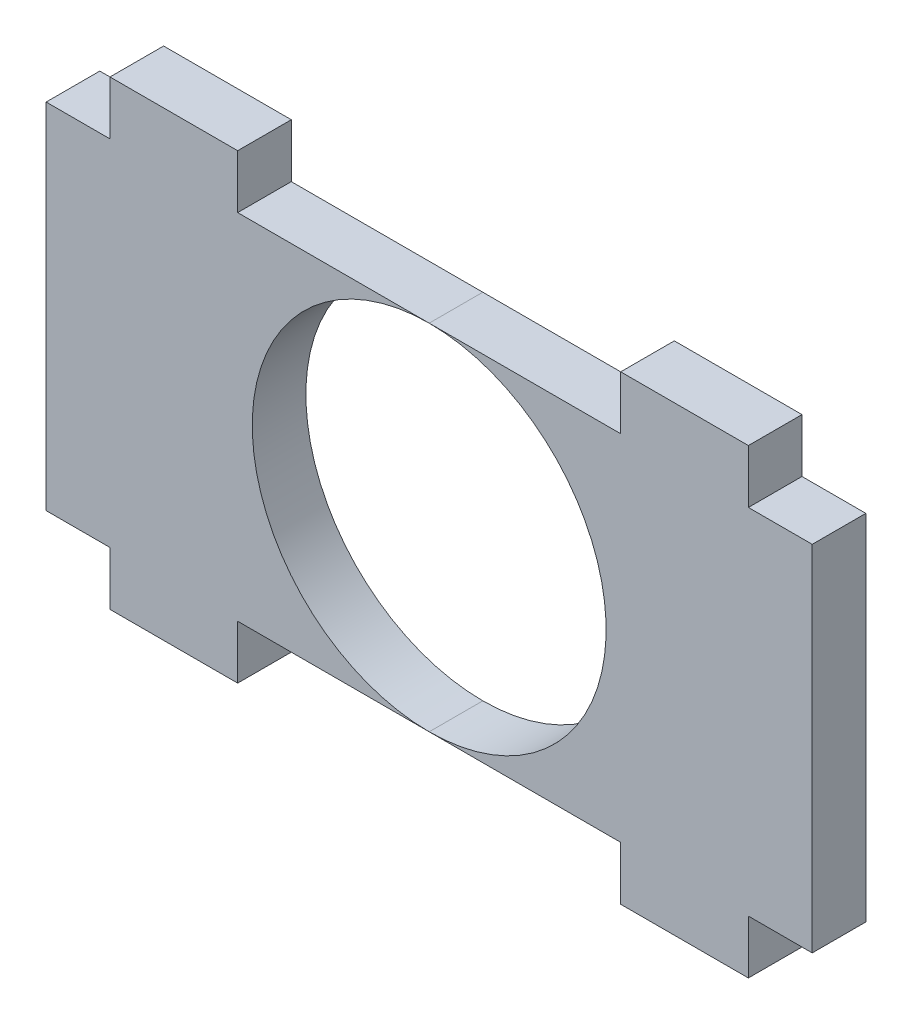
ISO-10303-21;
HEADER;
FILE_DESCRIPTION(('STEP AP214'),'2;1');
FILE_NAME('part.step','',(''),(''),'','','');
FILE_SCHEMA(('AUTOMOTIVE_DESIGN { 1 0 10303 214 1 1 1 1 }'));
ENDSEC;
DATA;
#1=APPLICATION_CONTEXT('core data for automotive mechanical design processes');
#2=APPLICATION_PROTOCOL_DEFINITION('international standard','automotive_design',2000,#1);
#3=PRODUCT_CONTEXT('',#1,'mechanical');
#4=PRODUCT('Part','Part','',(#3));
#5=PRODUCT_RELATED_PRODUCT_CATEGORY('part','',(#4));
#6=PRODUCT_DEFINITION_FORMATION('','',#4);
#7=PRODUCT_DEFINITION_CONTEXT('part definition',#1,'design');
#8=PRODUCT_DEFINITION('design','',#6,#7);
#9=PRODUCT_DEFINITION_SHAPE('','',#8);
#10=(LENGTH_UNIT() NAMED_UNIT(*) SI_UNIT(.MILLI.,.METRE.));
#11=(NAMED_UNIT(*) PLANE_ANGLE_UNIT() SI_UNIT($,.RADIAN.));
#12=(NAMED_UNIT(*) SI_UNIT($,.STERADIAN.) SOLID_ANGLE_UNIT());
#13=UNCERTAINTY_MEASURE_WITH_UNIT(LENGTH_MEASURE(1.E-05),#10,'distance_accuracy_value','');
#14=(GEOMETRIC_REPRESENTATION_CONTEXT(3) GLOBAL_UNCERTAINTY_ASSIGNED_CONTEXT((#13)) GLOBAL_UNIT_ASSIGNED_CONTEXT((#10,
#11,#12)) REPRESENTATION_CONTEXT('',''));
#15=CARTESIAN_POINT('',(0.,0.,0.));
#16=DIRECTION('',(0.,0.,1.));
#17=DIRECTION('',(1.,0.,0.));
#18=AXIS2_PLACEMENT_3D('',#15,#16,#17);
#19=CARTESIAN_POINT('',(0.,-17.6,5.334));
#20=DIRECTION('',(0.,1.,0.));
#21=DIRECTION('',(0.,0.,1.));
#22=AXIS2_PLACEMENT_3D('',#19,#20,#21);
#23=PLANE('',#22);
#24=DIRECTION('',(0.,0.,-1.));
#25=VECTOR('',#24,1.);
#26=CARTESIAN_POINT('',(19.05,-17.6,5.334));
#27=LINE('',#26,#25);
#28=CARTESIAN_POINT('',(19.05,-17.6,5.334));
#29=VERTEX_POINT('',#28);
#30=CARTESIAN_POINT('',(19.05,-17.6,0.));
#31=VERTEX_POINT('',#30);
#32=EDGE_CURVE('E92',#29,#31,#27,.T.);
#33=ORIENTED_EDGE('',*,*,#32,.F.);
#34=DIRECTION('',(1.,0.,0.));
#35=VECTOR('',#34,1.);
#36=CARTESIAN_POINT('',(0.,-17.6,5.334));
#37=LINE('',#36,#35);
#38=CARTESIAN_POINT('',(0.,-17.6,5.334));
#39=VERTEX_POINT('',#38);
#40=EDGE_CURVE('E182',#39,#29,#37,.T.);
#41=ORIENTED_EDGE('',*,*,#40,.F.);
#42=DIRECTION('',(0.,0.,-1.));
#43=VECTOR('',#42,1.);
#44=CARTESIAN_POINT('',(0.,-17.6,5.334));
#45=LINE('',#44,#43);
#46=CARTESIAN_POINT('',(0.,-17.6,0.));
#47=VERTEX_POINT('',#46);
#48=EDGE_CURVE('E13',#39,#47,#45,.T.);
#49=ORIENTED_EDGE('',*,*,#48,.T.);
#50=DIRECTION('',(1.,0.,0.));
#51=VECTOR('',#50,1.);
#52=CARTESIAN_POINT('',(0.,-17.6,0.));
#53=LINE('',#52,#51);
#54=EDGE_CURVE('E228',#47,#31,#53,.T.);
#55=ORIENTED_EDGE('',*,*,#54,.T.);
#56=EDGE_LOOP('',(#33,#41,#49,#55));
#57=FACE_BOUND('',#56,.T.);
#58=ADVANCED_FACE('F69',(#57),#23,.F.);
#59=DIRECTION('',(0.,0.,1.));
#60=VECTOR('',#59,1.);
#61=CARTESIAN_POINT('',(31.75,-17.6,5.334));
#62=LINE('',#61,#60);
#63=CARTESIAN_POINT('',(31.75,-17.6,0.));
#64=VERTEX_POINT('',#63);
#65=CARTESIAN_POINT('',(31.75,-17.6,5.334));
#66=VERTEX_POINT('',#65);
#67=EDGE_CURVE('E178',#64,#66,#62,.T.);
#68=ORIENTED_EDGE('',*,*,#67,.F.);
#69=CARTESIAN_POINT('',(38.1,-17.6,0.));
#70=VERTEX_POINT('',#69);
#71=EDGE_CURVE('E227',#64,#70,#53,.T.);
#72=ORIENTED_EDGE('',*,*,#71,.T.);
#73=DIRECTION('',(0.,0.,-1.));
#74=VECTOR('',#73,1.);
#75=CARTESIAN_POINT('',(38.1,-17.6,5.334));
#76=LINE('',#75,#74);
#77=CARTESIAN_POINT('',(38.1,-17.6,5.334));
#78=VERTEX_POINT('',#77);
#79=EDGE_CURVE('E77',#78,#70,#76,.T.);
#80=ORIENTED_EDGE('',*,*,#79,.F.);
#81=EDGE_CURVE('E84',#66,#78,#37,.T.);
#82=ORIENTED_EDGE('',*,*,#81,.F.);
#83=EDGE_LOOP('',(#68,#72,#80,#82));
#84=FACE_BOUND('',#83,.T.);
#85=ADVANCED_FACE('F275',(#84),#23,.F.);
#86=CARTESIAN_POINT('',(0.,17.6,5.334));
#87=DIRECTION('',(0.,1.,0.));
#88=DIRECTION('',(0.,0.,1.));
#89=AXIS2_PLACEMENT_3D('',#86,#87,#88);
#90=PLANE('',#89);
#91=DIRECTION('',(1.,0.,0.));
#92=VECTOR('',#91,1.);
#93=CARTESIAN_POINT('',(0.,17.6,5.334));
#94=LINE('',#93,#92);
#95=CARTESIAN_POINT('',(0.,17.6,5.334));
#96=VERTEX_POINT('',#95);
#97=CARTESIAN_POINT('',(19.05,17.6,5.334));
#98=VERTEX_POINT('',#97);
#99=EDGE_CURVE('E221',#96,#98,#94,.T.);
#100=ORIENTED_EDGE('',*,*,#99,.T.);
#101=DIRECTION('',(0.,0.,1.));
#102=VECTOR('',#101,1.);
#103=CARTESIAN_POINT('',(19.05,17.6,0.));
#104=LINE('',#103,#102);
#105=CARTESIAN_POINT('',(19.05,17.6,0.));
#106=VERTEX_POINT('',#105);
#107=EDGE_CURVE('E183',#106,#98,#104,.T.);
#108=ORIENTED_EDGE('',*,*,#107,.F.);
#109=DIRECTION('',(1.,0.,0.));
#110=VECTOR('',#109,1.);
#111=CARTESIAN_POINT('',(0.,17.6,0.));
#112=LINE('',#111,#110);
#113=CARTESIAN_POINT('',(0.,17.6,0.));
#114=VERTEX_POINT('',#113);
#115=EDGE_CURVE('E215',#114,#106,#112,.T.);
#116=ORIENTED_EDGE('',*,*,#115,.F.);
#117=DIRECTION('',(0.,0.,-1.));
#118=VECTOR('',#117,1.);
#119=CARTESIAN_POINT('',(0.,17.6,5.334));
#120=LINE('',#119,#118);
#121=EDGE_CURVE('E224',#96,#114,#120,.T.);
#122=ORIENTED_EDGE('',*,*,#121,.F.);
#123=EDGE_LOOP('',(#100,#108,#116,#122));
#124=FACE_BOUND('',#123,.T.);
#125=ADVANCED_FACE('F280',(#124),#90,.T.);
#126=CARTESIAN_POINT('',(31.75,17.6,0.));
#127=VERTEX_POINT('',#126);
#128=CARTESIAN_POINT('',(38.1,17.6,0.));
#129=VERTEX_POINT('',#128);
#130=EDGE_CURVE('E233',#127,#129,#112,.T.);
#131=ORIENTED_EDGE('',*,*,#130,.F.);
#132=DIRECTION('',(0.,0.,-1.));
#133=VECTOR('',#132,1.);
#134=CARTESIAN_POINT('',(31.75,17.6,0.));
#135=LINE('',#134,#133);
#136=CARTESIAN_POINT('',(31.75,17.6,5.334));
#137=VERTEX_POINT('',#136);
#138=EDGE_CURVE('E185',#137,#127,#135,.T.);
#139=ORIENTED_EDGE('',*,*,#138,.F.);
#140=CARTESIAN_POINT('',(38.1,17.6,5.334));
#141=VERTEX_POINT('',#140);
#142=EDGE_CURVE('E220',#137,#141,#94,.T.);
#143=ORIENTED_EDGE('',*,*,#142,.T.);
#144=DIRECTION('',(0.,0.,-1.));
#145=VECTOR('',#144,1.);
#146=CARTESIAN_POINT('',(38.1,17.6,5.334));
#147=LINE('',#146,#145);
#148=EDGE_CURVE('E237',#141,#129,#147,.T.);
#149=ORIENTED_EDGE('',*,*,#148,.T.);
#150=EDGE_LOOP('',(#131,#139,#143,#149));
#151=FACE_BOUND('',#150,.T.);
#152=ADVANCED_FACE('F253',(#151),#90,.T.);
#153=CARTESIAN_POINT('',(0.,0.,5.334));
#154=DIRECTION('',(0.,0.,-1.));
#155=DIRECTION('',(-1.,0.,0.));
#156=AXIS2_PLACEMENT_3D('',#153,#154,#155);
#157=CYLINDRICAL_SURFACE('',#156,17.6);
#158=CARTESIAN_POINT('',(0.,0.,0.));
#159=DIRECTION('',(0.,0.,1.));
#160=DIRECTION('',(1.,0.,0.));
#161=AXIS2_PLACEMENT_3D('',#158,#159,#160);
#162=CIRCLE('',#161,17.6);
#163=EDGE_CURVE('E211',#47,#114,#162,.T.);
#164=ORIENTED_EDGE('',*,*,#163,.F.);
#165=ORIENTED_EDGE('',*,*,#48,.F.);
#166=CARTESIAN_POINT('',(0.,0.,5.334));
#167=DIRECTION('',(0.,0.,1.));
#168=DIRECTION('',(1.,0.,0.));
#169=AXIS2_PLACEMENT_3D('',#166,#167,#168);
#170=CIRCLE('',#169,17.6);
#171=EDGE_CURVE('E212',#39,#96,#170,.T.);
#172=ORIENTED_EDGE('',*,*,#171,.T.);
#173=ORIENTED_EDGE('',*,*,#121,.T.);
#174=EDGE_LOOP('',(#164,#165,#172,#173));
#175=FACE_BOUND('',#174,.T.);
#176=ADVANCED_FACE('F71',(#175),#157,.F.);
#177=CARTESIAN_POINT('',(38.1,0.,5.334));
#178=DIRECTION('',(1.,0.,0.));
#179=DIRECTION('',(0.,0.,-1.));
#180=AXIS2_PLACEMENT_3D('',#177,#178,#179);
#181=PLANE('',#180);
#182=DIRECTION('',(0.,-1.,0.));
#183=VECTOR('',#182,1.);
#184=CARTESIAN_POINT('',(38.1,0.,0.));
#185=LINE('',#184,#183);
#186=EDGE_CURVE('E230',#129,#70,#185,.T.);
#187=ORIENTED_EDGE('',*,*,#186,.F.);
#188=ORIENTED_EDGE('',*,*,#148,.F.);
#189=DIRECTION('',(0.,-1.,0.));
#190=VECTOR('',#189,1.);
#191=CARTESIAN_POINT('',(38.1,0.,5.334));
#192=LINE('',#191,#190);
#193=EDGE_CURVE('E217',#141,#78,#192,.T.);
#194=ORIENTED_EDGE('',*,*,#193,.T.);
#195=ORIENTED_EDGE('',*,*,#79,.T.);
#196=EDGE_LOOP('',(#187,#188,#194,#195));
#197=FACE_BOUND('',#196,.T.);
#198=ADVANCED_FACE('F242',(#197),#181,.T.);
#199=CARTESIAN_POINT('',(0.,0.,5.334));
#200=DIRECTION('',(0.,0.,1.));
#201=DIRECTION('',(1.,0.,0.));
#202=AXIS2_PLACEMENT_3D('',#199,#200,#201);
#203=PLANE('',#202);
#204=ORIENTED_EDGE('',*,*,#171,.F.);
#205=ORIENTED_EDGE('',*,*,#40,.T.);
#206=DIRECTION('',(0.,1.,0.));
#207=VECTOR('',#206,1.);
#208=CARTESIAN_POINT('',(19.05,-22.934,5.334));
#209=LINE('',#208,#207);
#210=CARTESIAN_POINT('',(19.05,-22.934,5.334));
#211=VERTEX_POINT('',#210);
#212=EDGE_CURVE('E163',#211,#29,#209,.T.);
#213=ORIENTED_EDGE('',*,*,#212,.F.);
#214=DIRECTION('',(-1.,0.,0.));
#215=VECTOR('',#214,1.);
#216=CARTESIAN_POINT('',(31.75,-22.934,5.334));
#217=LINE('',#216,#215);
#218=CARTESIAN_POINT('',(31.75,-22.934,5.334));
#219=VERTEX_POINT('',#218);
#220=EDGE_CURVE('E169',#219,#211,#217,.T.);
#221=ORIENTED_EDGE('',*,*,#220,.F.);
#222=DIRECTION('',(0.,1.,0.));
#223=VECTOR('',#222,1.);
#224=CARTESIAN_POINT('',(31.75,-22.934,5.334));
#225=LINE('',#224,#223);
#226=EDGE_CURVE('E256',#219,#66,#225,.T.);
#227=ORIENTED_EDGE('',*,*,#226,.T.);
#228=ORIENTED_EDGE('',*,*,#81,.T.);
#229=ORIENTED_EDGE('',*,*,#193,.F.);
#230=ORIENTED_EDGE('',*,*,#142,.F.);
#231=DIRECTION('',(0.,-1.,0.));
#232=VECTOR('',#231,1.);
#233=CARTESIAN_POINT('',(31.75,22.934,5.334));
#234=LINE('',#233,#232);
#235=CARTESIAN_POINT('',(31.75,22.934,5.334));
#236=VERTEX_POINT('',#235);
#237=EDGE_CURVE('E204',#236,#137,#234,.T.);
#238=ORIENTED_EDGE('',*,*,#237,.F.);
#239=DIRECTION('',(1.,0.,0.));
#240=VECTOR('',#239,1.);
#241=CARTESIAN_POINT('',(31.75,22.934,5.334));
#242=LINE('',#241,#240);
#243=CARTESIAN_POINT('',(19.05,22.934,5.334));
#244=VERTEX_POINT('',#243);
#245=EDGE_CURVE('E196',#244,#236,#242,.T.);
#246=ORIENTED_EDGE('',*,*,#245,.F.);
#247=DIRECTION('',(0.,-1.,0.));
#248=VECTOR('',#247,1.);
#249=CARTESIAN_POINT('',(19.05,22.934,5.334));
#250=LINE('',#249,#248);
#251=EDGE_CURVE('E206',#244,#98,#250,.T.);
#252=ORIENTED_EDGE('',*,*,#251,.T.);
#253=ORIENTED_EDGE('',*,*,#99,.F.);
#254=EDGE_LOOP('',(#204,#205,#213,#221,#227,#228,#229,#230,#238,#246,#252,#253));
#255=FACE_BOUND('',#254,.T.);
#256=ADVANCED_FACE('F181',(#255),#203,.T.);
#257=CARTESIAN_POINT('',(0.,0.,0.));
#258=DIRECTION('',(0.,0.,1.));
#259=DIRECTION('',(1.,0.,0.));
#260=AXIS2_PLACEMENT_3D('',#257,#258,#259);
#261=PLANE('',#260);
#262=ORIENTED_EDGE('',*,*,#163,.T.);
#263=ORIENTED_EDGE('',*,*,#115,.T.);
#264=DIRECTION('',(0.,-1.,0.));
#265=VECTOR('',#264,1.);
#266=CARTESIAN_POINT('',(19.05,22.934,0.));
#267=LINE('',#266,#265);
#268=CARTESIAN_POINT('',(19.05,22.934,0.));
#269=VERTEX_POINT('',#268);
#270=EDGE_CURVE('E209',#269,#106,#267,.T.);
#271=ORIENTED_EDGE('',*,*,#270,.F.);
#272=DIRECTION('',(-1.,0.,0.));
#273=VECTOR('',#272,1.);
#274=CARTESIAN_POINT('',(31.75,22.934,0.));
#275=LINE('',#274,#273);
#276=CARTESIAN_POINT('',(31.75,22.934,0.));
#277=VERTEX_POINT('',#276);
#278=EDGE_CURVE('E191',#277,#269,#275,.T.);
#279=ORIENTED_EDGE('',*,*,#278,.F.);
#280=DIRECTION('',(0.,-1.,0.));
#281=VECTOR('',#280,1.);
#282=CARTESIAN_POINT('',(31.75,22.934,0.));
#283=LINE('',#282,#281);
#284=EDGE_CURVE('E199',#277,#127,#283,.T.);
#285=ORIENTED_EDGE('',*,*,#284,.T.);
#286=ORIENTED_EDGE('',*,*,#130,.T.);
#287=ORIENTED_EDGE('',*,*,#186,.T.);
#288=ORIENTED_EDGE('',*,*,#71,.F.);
#289=DIRECTION('',(0.,1.,0.));
#290=VECTOR('',#289,1.);
#291=CARTESIAN_POINT('',(31.75,-22.934,0.));
#292=LINE('',#291,#290);
#293=CARTESIAN_POINT('',(31.75,-22.934,0.));
#294=VERTEX_POINT('',#293);
#295=EDGE_CURVE('E187',#294,#64,#292,.T.);
#296=ORIENTED_EDGE('',*,*,#295,.F.);
#297=DIRECTION('',(1.,0.,0.));
#298=VECTOR('',#297,1.);
#299=CARTESIAN_POINT('',(31.75,-22.934,0.));
#300=LINE('',#299,#298);
#301=CARTESIAN_POINT('',(19.05,-22.934,0.));
#302=VERTEX_POINT('',#301);
#303=EDGE_CURVE('E168',#302,#294,#300,.T.);
#304=ORIENTED_EDGE('',*,*,#303,.F.);
#305=DIRECTION('',(0.,1.,0.));
#306=VECTOR('',#305,1.);
#307=CARTESIAN_POINT('',(19.05,-22.934,0.));
#308=LINE('',#307,#306);
#309=EDGE_CURVE('E165',#302,#31,#308,.T.);
#310=ORIENTED_EDGE('',*,*,#309,.T.);
#311=ORIENTED_EDGE('',*,*,#54,.F.);
#312=EDGE_LOOP('',(#262,#263,#271,#279,#285,#286,#287,#288,#296,#304,#310,#311));
#313=FACE_BOUND('',#312,.T.);
#314=ADVANCED_FACE('F246',(#313),#261,.F.);
#315=CARTESIAN_POINT('',(19.05,22.934,0.));
#316=DIRECTION('',(1.,0.,0.));
#317=DIRECTION('',(0.,0.,-1.));
#318=AXIS2_PLACEMENT_3D('',#315,#316,#317);
#319=PLANE('',#318);
#320=ORIENTED_EDGE('',*,*,#107,.T.);
#321=ORIENTED_EDGE('',*,*,#251,.F.);
#322=DIRECTION('',(0.,0.,1.));
#323=VECTOR('',#322,1.);
#324=CARTESIAN_POINT('',(19.05,22.934,0.));
#325=LINE('',#324,#323);
#326=EDGE_CURVE('E194',#269,#244,#325,.T.);
#327=ORIENTED_EDGE('',*,*,#326,.F.);
#328=ORIENTED_EDGE('',*,*,#270,.T.);
#329=EDGE_LOOP('',(#320,#321,#327,#328));
#330=FACE_BOUND('',#329,.T.);
#331=ADVANCED_FACE('F289',(#330),#319,.F.);
#332=CARTESIAN_POINT('',(31.75,22.934,0.));
#333=DIRECTION('',(-1.,0.,0.));
#334=DIRECTION('',(0.,0.,1.));
#335=AXIS2_PLACEMENT_3D('',#332,#333,#334);
#336=PLANE('',#335);
#337=ORIENTED_EDGE('',*,*,#138,.T.);
#338=ORIENTED_EDGE('',*,*,#284,.F.);
#339=DIRECTION('',(0.,0.,-1.));
#340=VECTOR('',#339,1.);
#341=CARTESIAN_POINT('',(31.75,22.934,0.));
#342=LINE('',#341,#340);
#343=EDGE_CURVE('E198',#236,#277,#342,.T.);
#344=ORIENTED_EDGE('',*,*,#343,.F.);
#345=ORIENTED_EDGE('',*,*,#237,.T.);
#346=EDGE_LOOP('',(#337,#338,#344,#345));
#347=FACE_BOUND('',#346,.T.);
#348=ADVANCED_FACE('F294',(#347),#336,.F.);
#349=CARTESIAN_POINT('',(0.,22.934,0.));
#350=DIRECTION('',(0.,1.,0.));
#351=DIRECTION('',(0.,0.,1.));
#352=AXIS2_PLACEMENT_3D('',#349,#350,#351);
#353=PLANE('',#352);
#354=ORIENTED_EDGE('',*,*,#278,.T.);
#355=ORIENTED_EDGE('',*,*,#326,.T.);
#356=ORIENTED_EDGE('',*,*,#245,.T.);
#357=ORIENTED_EDGE('',*,*,#343,.T.);
#358=EDGE_LOOP('',(#354,#355,#356,#357));
#359=FACE_BOUND('',#358,.T.);
#360=ADVANCED_FACE('F272',(#359),#353,.T.);
#361=CARTESIAN_POINT('',(19.05,-22.934,5.334));
#362=DIRECTION('',(1.,0.,0.));
#363=DIRECTION('',(0.,0.,-1.));
#364=AXIS2_PLACEMENT_3D('',#361,#362,#363);
#365=PLANE('',#364);
#366=ORIENTED_EDGE('',*,*,#32,.T.);
#367=ORIENTED_EDGE('',*,*,#309,.F.);
#368=DIRECTION('',(0.,0.,-1.));
#369=VECTOR('',#368,1.);
#370=CARTESIAN_POINT('',(19.05,-22.934,5.334));
#371=LINE('',#370,#369);
#372=EDGE_CURVE('E159',#211,#302,#371,.T.);
#373=ORIENTED_EDGE('',*,*,#372,.F.);
#374=ORIENTED_EDGE('',*,*,#212,.T.);
#375=EDGE_LOOP('',(#366,#367,#373,#374));
#376=FACE_BOUND('',#375,.T.);
#377=ADVANCED_FACE('F161',(#376),#365,.F.);
#378=CARTESIAN_POINT('',(31.75,-22.934,5.334));
#379=DIRECTION('',(-1.,0.,0.));
#380=DIRECTION('',(0.,0.,1.));
#381=AXIS2_PLACEMENT_3D('',#378,#379,#380);
#382=PLANE('',#381);
#383=ORIENTED_EDGE('',*,*,#67,.T.);
#384=ORIENTED_EDGE('',*,*,#226,.F.);
#385=DIRECTION('',(0.,0.,1.));
#386=VECTOR('',#385,1.);
#387=CARTESIAN_POINT('',(31.75,-22.934,5.334));
#388=LINE('',#387,#386);
#389=EDGE_CURVE('E174',#294,#219,#388,.T.);
#390=ORIENTED_EDGE('',*,*,#389,.F.);
#391=ORIENTED_EDGE('',*,*,#295,.T.);
#392=EDGE_LOOP('',(#383,#384,#390,#391));
#393=FACE_BOUND('',#392,.T.);
#394=ADVANCED_FACE('F264',(#393),#382,.F.);
#395=CARTESIAN_POINT('',(0.,-22.934,0.));
#396=DIRECTION('',(0.,-1.,0.));
#397=DIRECTION('',(0.,0.,-1.));
#398=AXIS2_PLACEMENT_3D('',#395,#396,#397);
#399=PLANE('',#398);
#400=ORIENTED_EDGE('',*,*,#220,.T.);
#401=ORIENTED_EDGE('',*,*,#372,.T.);
#402=ORIENTED_EDGE('',*,*,#303,.T.);
#403=ORIENTED_EDGE('',*,*,#389,.T.);
#404=EDGE_LOOP('',(#400,#401,#402,#403));
#405=FACE_BOUND('',#404,.T.);
#406=ADVANCED_FACE('F172',(#405),#399,.T.);
#407=CLOSED_SHELL('',(#58,#85,#125,#152,#176,#198,#256,#314,#331,#348,#360,#377,#394,#406));
#408=MANIFOLD_SOLID_BREP('B2',#407);
#409=CARTESIAN_POINT('',(0.,-17.6,5.334));
#410=DIRECTION('',(0.,1.,0.));
#411=DIRECTION('',(0.,0.,1.));
#412=AXIS2_PLACEMENT_3D('',#409,#410,#411);
#413=PLANE('',#412);
#414=DIRECTION('',(0.,0.,-1.));
#415=VECTOR('',#414,1.);
#416=CARTESIAN_POINT('',(-31.75,-17.6,5.334));
#417=LINE('',#416,#415);
#418=CARTESIAN_POINT('',(-31.75,-17.6,5.334));
#419=VERTEX_POINT('',#418);
#420=CARTESIAN_POINT('',(-31.75,-17.6,0.));
#421=VERTEX_POINT('',#420);
#422=EDGE_CURVE('E430',#419,#421,#417,.T.);
#423=ORIENTED_EDGE('',*,*,#422,.F.);
#424=DIRECTION('',(1.,0.,0.));
#425=VECTOR('',#424,1.);
#426=CARTESIAN_POINT('',(0.,-17.6,5.334));
#427=LINE('',#426,#425);
#428=CARTESIAN_POINT('',(-38.1,-17.6,5.334));
#429=VERTEX_POINT('',#428);
#430=EDGE_CURVE('E561',#429,#419,#427,.T.);
#431=ORIENTED_EDGE('',*,*,#430,.F.);
#432=DIRECTION('',(0.,0.,-1.));
#433=VECTOR('',#432,1.);
#434=CARTESIAN_POINT('',(-38.1,-17.6,5.334));
#435=LINE('',#434,#433);
#436=CARTESIAN_POINT('',(-38.1,-17.6,0.));
#437=VERTEX_POINT('',#436);
#438=EDGE_CURVE('E575',#429,#437,#435,.T.);
#439=ORIENTED_EDGE('',*,*,#438,.T.);
#440=DIRECTION('',(1.,0.,0.));
#441=VECTOR('',#440,1.);
#442=CARTESIAN_POINT('',(0.,-17.6,0.));
#443=LINE('',#442,#441);
#444=EDGE_CURVE('E555',#437,#421,#443,.T.);
#445=ORIENTED_EDGE('',*,*,#444,.T.);
#446=EDGE_LOOP('',(#423,#431,#439,#445));
#447=FACE_BOUND('',#446,.T.);
#448=ADVANCED_FACE('F407',(#447),#413,.F.);
#449=DIRECTION('',(0.,0.,1.));
#450=VECTOR('',#449,1.);
#451=CARTESIAN_POINT('',(-19.05,-17.6,5.334));
#452=LINE('',#451,#450);
#453=CARTESIAN_POINT('',(-19.05,-17.6,0.));
#454=VERTEX_POINT('',#453);
#455=CARTESIAN_POINT('',(-19.05,-17.6,5.334));
#456=VERTEX_POINT('',#455);
#457=EDGE_CURVE('E519',#454,#456,#452,.T.);
#458=ORIENTED_EDGE('',*,*,#457,.F.);
#459=CARTESIAN_POINT('',(0.,-17.6,0.));
#460=VERTEX_POINT('',#459);
#461=EDGE_CURVE('E571',#454,#460,#443,.T.);
#462=ORIENTED_EDGE('',*,*,#461,.T.);
#463=DIRECTION('',(0.,0.,-1.));
#464=VECTOR('',#463,1.);
#465=CARTESIAN_POINT('',(0.,-17.6,5.334));
#466=LINE('',#465,#464);
#467=CARTESIAN_POINT('',(0.,-17.6,5.334));
#468=VERTEX_POINT('',#467);
#469=EDGE_CURVE('E563',#468,#460,#466,.T.);
#470=ORIENTED_EDGE('',*,*,#469,.F.);
#471=EDGE_CURVE('E422',#456,#468,#427,.T.);
#472=ORIENTED_EDGE('',*,*,#471,.F.);
#473=EDGE_LOOP('',(#458,#462,#470,#472));
#474=FACE_BOUND('',#473,.T.);
#475=ADVANCED_FACE('F609',(#474),#413,.F.);
#476=CARTESIAN_POINT('',(0.,17.6,5.334));
#477=DIRECTION('',(0.,1.,0.));
#478=DIRECTION('',(0.,0.,1.));
#479=AXIS2_PLACEMENT_3D('',#476,#477,#478);
#480=PLANE('',#479);
#481=DIRECTION('',(1.,0.,0.));
#482=VECTOR('',#481,1.);
#483=CARTESIAN_POINT('',(0.,17.6,5.334));
#484=LINE('',#483,#482);
#485=CARTESIAN_POINT('',(-38.1,17.6,5.334));
#486=VERTEX_POINT('',#485);
#487=CARTESIAN_POINT('',(-31.75,17.6,5.334));
#488=VERTEX_POINT('',#487);
#489=EDGE_CURVE('E556',#486,#488,#484,.T.);
#490=ORIENTED_EDGE('',*,*,#489,.T.);
#491=DIRECTION('',(0.,0.,1.));
#492=VECTOR('',#491,1.);
#493=CARTESIAN_POINT('',(-31.75,17.6,0.));
#494=LINE('',#493,#492);
#495=CARTESIAN_POINT('',(-31.75,17.6,0.));
#496=VERTEX_POINT('',#495);
#497=EDGE_CURVE('E522',#496,#488,#494,.T.);
#498=ORIENTED_EDGE('',*,*,#497,.F.);
#499=DIRECTION('',(1.,0.,0.));
#500=VECTOR('',#499,1.);
#501=CARTESIAN_POINT('',(0.,17.6,0.));
#502=LINE('',#501,#500);
#503=CARTESIAN_POINT('',(-38.1,17.6,0.));
#504=VERTEX_POINT('',#503);
#505=EDGE_CURVE('E566',#504,#496,#502,.T.);
#506=ORIENTED_EDGE('',*,*,#505,.F.);
#507=DIRECTION('',(0.,0.,-1.));
#508=VECTOR('',#507,1.);
#509=CARTESIAN_POINT('',(-38.1,17.6,5.334));
#510=LINE('',#509,#508);
#511=EDGE_CURVE('E415',#486,#504,#510,.T.);
#512=ORIENTED_EDGE('',*,*,#511,.F.);
#513=EDGE_LOOP('',(#490,#498,#506,#512));
#514=FACE_BOUND('',#513,.T.);
#515=ADVANCED_FACE('F587',(#514),#480,.T.);
#516=CARTESIAN_POINT('',(-19.05,17.6,0.));
#517=VERTEX_POINT('',#516);
#518=CARTESIAN_POINT('',(0.,17.6,0.));
#519=VERTEX_POINT('',#518);
#520=EDGE_CURVE('E565',#517,#519,#502,.T.);
#521=ORIENTED_EDGE('',*,*,#520,.F.);
#522=DIRECTION('',(0.,0.,-1.));
#523=VECTOR('',#522,1.);
#524=CARTESIAN_POINT('',(-19.05,17.6,0.));
#525=LINE('',#524,#523);
#526=CARTESIAN_POINT('',(-19.05,17.6,5.334));
#527=VERTEX_POINT('',#526);
#528=EDGE_CURVE('E525',#527,#517,#525,.T.);
#529=ORIENTED_EDGE('',*,*,#528,.F.);
#530=CARTESIAN_POINT('',(0.,17.6,5.334));
#531=VERTEX_POINT('',#530);
#532=EDGE_CURVE('E554',#527,#531,#484,.T.);
#533=ORIENTED_EDGE('',*,*,#532,.T.);
#534=DIRECTION('',(0.,0.,-1.));
#535=VECTOR('',#534,1.);
#536=CARTESIAN_POINT('',(0.,17.6,5.334));
#537=LINE('',#536,#535);
#538=EDGE_CURVE('E67',#531,#519,#537,.T.);
#539=ORIENTED_EDGE('',*,*,#538,.T.);
#540=EDGE_LOOP('',(#521,#529,#533,#539));
#541=FACE_BOUND('',#540,.T.);
#542=ADVANCED_FACE('F604',(#541),#480,.T.);
#543=CARTESIAN_POINT('',(0.,0.,5.334));
#544=DIRECTION('',(0.,0.,-1.));
#545=DIRECTION('',(-1.,0.,0.));
#546=AXIS2_PLACEMENT_3D('',#543,#544,#545);
#547=CYLINDRICAL_SURFACE('',#546,17.6);
#548=CARTESIAN_POINT('',(0.,0.,0.));
#549=DIRECTION('',(0.,0.,1.));
#550=DIRECTION('',(1.,0.,0.));
#551=AXIS2_PLACEMENT_3D('',#548,#549,#550);
#552=CIRCLE('',#551,17.6);
#553=EDGE_CURVE('E550',#519,#460,#552,.T.);
#554=ORIENTED_EDGE('',*,*,#553,.F.);
#555=ORIENTED_EDGE('',*,*,#538,.F.);
#556=CARTESIAN_POINT('',(0.,0.,5.334));
#557=DIRECTION('',(0.,0.,1.));
#558=DIRECTION('',(1.,0.,0.));
#559=AXIS2_PLACEMENT_3D('',#556,#557,#558);
#560=CIRCLE('',#559,17.6);
#561=EDGE_CURVE('E551',#531,#468,#560,.T.);
#562=ORIENTED_EDGE('',*,*,#561,.T.);
#563=ORIENTED_EDGE('',*,*,#469,.T.);
#564=EDGE_LOOP('',(#554,#555,#562,#563));
#565=FACE_BOUND('',#564,.T.);
#566=ADVANCED_FACE('F409',(#565),#547,.F.);
#567=CARTESIAN_POINT('',(-38.1,0.,5.334));
#568=DIRECTION('',(1.,0.,0.));
#569=DIRECTION('',(0.,1.,0.));
#570=AXIS2_PLACEMENT_3D('',#567,#568,#569);
#571=PLANE('',#570);
#572=DIRECTION('',(0.,-1.,0.));
#573=VECTOR('',#572,1.);
#574=CARTESIAN_POINT('',(-38.1,0.,0.));
#575=LINE('',#574,#573);
#576=EDGE_CURVE('E569',#504,#437,#575,.T.);
#577=ORIENTED_EDGE('',*,*,#576,.T.);
#578=ORIENTED_EDGE('',*,*,#438,.F.);
#579=DIRECTION('',(0.,-1.,0.));
#580=VECTOR('',#579,1.);
#581=CARTESIAN_POINT('',(-38.1,0.,5.334));
#582=LINE('',#581,#580);
#583=EDGE_CURVE('E559',#486,#429,#582,.T.);
#584=ORIENTED_EDGE('',*,*,#583,.F.);
#585=ORIENTED_EDGE('',*,*,#511,.T.);
#586=EDGE_LOOP('',(#577,#578,#584,#585));
#587=FACE_BOUND('',#586,.T.);
#588=ADVANCED_FACE('F580',(#587),#571,.F.);
#589=CARTESIAN_POINT('',(0.,0.,5.334));
#590=DIRECTION('',(0.,0.,1.));
#591=DIRECTION('',(1.,0.,0.));
#592=AXIS2_PLACEMENT_3D('',#589,#590,#591);
#593=PLANE('',#592);
#594=ORIENTED_EDGE('',*,*,#561,.F.);
#595=ORIENTED_EDGE('',*,*,#532,.F.);
#596=DIRECTION('',(0.,-1.,0.));
#597=VECTOR('',#596,1.);
#598=CARTESIAN_POINT('',(-19.05,22.934,5.334));
#599=LINE('',#598,#597);
#600=CARTESIAN_POINT('',(-19.05,22.934,5.334));
#601=VERTEX_POINT('',#600);
#602=EDGE_CURVE('E546',#601,#527,#599,.T.);
#603=ORIENTED_EDGE('',*,*,#602,.F.);
#604=DIRECTION('',(1.,0.,0.));
#605=VECTOR('',#604,1.);
#606=CARTESIAN_POINT('',(-31.75,22.934,5.334));
#607=LINE('',#606,#605);
#608=CARTESIAN_POINT('',(-31.75,22.934,5.334));
#609=VERTEX_POINT('',#608);
#610=EDGE_CURVE('E534',#609,#601,#607,.T.);
#611=ORIENTED_EDGE('',*,*,#610,.F.);
#612=DIRECTION('',(0.,-1.,0.));
#613=VECTOR('',#612,1.);
#614=CARTESIAN_POINT('',(-31.75,22.934,5.334));
#615=LINE('',#614,#613);
#616=EDGE_CURVE('E548',#609,#488,#615,.T.);
#617=ORIENTED_EDGE('',*,*,#616,.T.);
#618=ORIENTED_EDGE('',*,*,#489,.F.);
#619=ORIENTED_EDGE('',*,*,#583,.T.);
#620=ORIENTED_EDGE('',*,*,#430,.T.);
#621=DIRECTION('',(0.,1.,0.));
#622=VECTOR('',#621,1.);
#623=CARTESIAN_POINT('',(-31.75,-22.934,5.334));
#624=LINE('',#623,#622);
#625=CARTESIAN_POINT('',(-31.75,-22.934,5.334));
#626=VERTEX_POINT('',#625);
#627=EDGE_CURVE('E616',#626,#419,#624,.T.);
#628=ORIENTED_EDGE('',*,*,#627,.F.);
#629=DIRECTION('',(-1.,0.,0.));
#630=VECTOR('',#629,1.);
#631=CARTESIAN_POINT('',(-31.75,-22.934,5.334));
#632=LINE('',#631,#630);
#633=CARTESIAN_POINT('',(-19.05,-22.934,5.334));
#634=VERTEX_POINT('',#633);
#635=EDGE_CURVE('E515',#634,#626,#632,.T.);
#636=ORIENTED_EDGE('',*,*,#635,.F.);
#637=DIRECTION('',(0.,1.,0.));
#638=VECTOR('',#637,1.);
#639=CARTESIAN_POINT('',(-19.05,-22.934,5.334));
#640=LINE('',#639,#638);
#641=EDGE_CURVE('E527',#634,#456,#640,.T.);
#642=ORIENTED_EDGE('',*,*,#641,.T.);
#643=ORIENTED_EDGE('',*,*,#471,.T.);
#644=EDGE_LOOP('',(#594,#595,#603,#611,#617,#618,#619,#620,#628,#636,#642,#643));
#645=FACE_BOUND('',#644,.T.);
#646=ADVANCED_FACE('F621',(#645),#593,.T.);
#647=CARTESIAN_POINT('',(0.,0.,0.));
#648=DIRECTION('',(0.,0.,1.));
#649=DIRECTION('',(1.,0.,0.));
#650=AXIS2_PLACEMENT_3D('',#647,#648,#649);
#651=PLANE('',#650);
#652=ORIENTED_EDGE('',*,*,#553,.T.);
#653=ORIENTED_EDGE('',*,*,#461,.F.);
#654=DIRECTION('',(0.,1.,0.));
#655=VECTOR('',#654,1.);
#656=CARTESIAN_POINT('',(-19.05,-22.934,0.));
#657=LINE('',#656,#655);
#658=CARTESIAN_POINT('',(-19.05,-22.934,0.));
#659=VERTEX_POINT('',#658);
#660=EDGE_CURVE('E506',#659,#454,#657,.T.);
#661=ORIENTED_EDGE('',*,*,#660,.F.);
#662=DIRECTION('',(1.,0.,0.));
#663=VECTOR('',#662,1.);
#664=CARTESIAN_POINT('',(-31.75,-22.934,0.));
#665=LINE('',#664,#663);
#666=CARTESIAN_POINT('',(-31.75,-22.934,0.));
#667=VERTEX_POINT('',#666);
#668=EDGE_CURVE('E498',#667,#659,#665,.T.);
#669=ORIENTED_EDGE('',*,*,#668,.F.);
#670=DIRECTION('',(0.,1.,0.));
#671=VECTOR('',#670,1.);
#672=CARTESIAN_POINT('',(-31.75,-22.934,0.));
#673=LINE('',#672,#671);
#674=EDGE_CURVE('E504',#667,#421,#673,.T.);
#675=ORIENTED_EDGE('',*,*,#674,.T.);
#676=ORIENTED_EDGE('',*,*,#444,.F.);
#677=ORIENTED_EDGE('',*,*,#576,.F.);
#678=ORIENTED_EDGE('',*,*,#505,.T.);
#679=DIRECTION('',(0.,-1.,0.));
#680=VECTOR('',#679,1.);
#681=CARTESIAN_POINT('',(-31.75,22.934,0.));
#682=LINE('',#681,#680);
#683=CARTESIAN_POINT('',(-31.75,22.934,0.));
#684=VERTEX_POINT('',#683);
#685=EDGE_CURVE('E539',#684,#496,#682,.T.);
#686=ORIENTED_EDGE('',*,*,#685,.F.);
#687=DIRECTION('',(-1.,0.,0.));
#688=VECTOR('',#687,1.);
#689=CARTESIAN_POINT('',(-31.75,22.934,0.));
#690=LINE('',#689,#688);
#691=CARTESIAN_POINT('',(-19.05,22.934,0.));
#692=VERTEX_POINT('',#691);
#693=EDGE_CURVE('E538',#692,#684,#690,.T.);
#694=ORIENTED_EDGE('',*,*,#693,.F.);
#695=DIRECTION('',(0.,-1.,0.));
#696=VECTOR('',#695,1.);
#697=CARTESIAN_POINT('',(-19.05,22.934,0.));
#698=LINE('',#697,#696);
#699=EDGE_CURVE('E544',#692,#517,#698,.T.);
#700=ORIENTED_EDGE('',*,*,#699,.T.);
#701=ORIENTED_EDGE('',*,*,#520,.T.);
#702=EDGE_LOOP('',(#652,#653,#661,#669,#675,#676,#677,#678,#686,#694,#700,#701));
#703=FACE_BOUND('',#702,.T.);
#704=ADVANCED_FACE('F501',(#703),#651,.F.);
#705=CARTESIAN_POINT('',(-31.75,22.934,0.));
#706=DIRECTION('',(1.,0.,0.));
#707=DIRECTION('',(0.,0.,-1.));
#708=AXIS2_PLACEMENT_3D('',#705,#706,#707);
#709=PLANE('',#708);
#710=ORIENTED_EDGE('',*,*,#497,.T.);
#711=ORIENTED_EDGE('',*,*,#616,.F.);
#712=DIRECTION('',(0.,0.,1.));
#713=VECTOR('',#712,1.);
#714=CARTESIAN_POINT('',(-31.75,22.934,0.));
#715=LINE('',#714,#713);
#716=EDGE_CURVE('E531',#684,#609,#715,.T.);
#717=ORIENTED_EDGE('',*,*,#716,.F.);
#718=ORIENTED_EDGE('',*,*,#685,.T.);
#719=EDGE_LOOP('',(#710,#711,#717,#718));
#720=FACE_BOUND('',#719,.T.);
#721=ADVANCED_FACE('F590',(#720),#709,.F.);
#722=CARTESIAN_POINT('',(-19.05,22.934,0.));
#723=DIRECTION('',(-1.,0.,0.));
#724=DIRECTION('',(0.,0.,1.));
#725=AXIS2_PLACEMENT_3D('',#722,#723,#724);
#726=PLANE('',#725);
#727=ORIENTED_EDGE('',*,*,#528,.T.);
#728=ORIENTED_EDGE('',*,*,#699,.F.);
#729=DIRECTION('',(0.,0.,-1.));
#730=VECTOR('',#729,1.);
#731=CARTESIAN_POINT('',(-19.05,22.934,0.));
#732=LINE('',#731,#730);
#733=EDGE_CURVE('E536',#601,#692,#732,.T.);
#734=ORIENTED_EDGE('',*,*,#733,.F.);
#735=ORIENTED_EDGE('',*,*,#602,.T.);
#736=EDGE_LOOP('',(#727,#728,#734,#735));
#737=FACE_BOUND('',#736,.T.);
#738=ADVANCED_FACE('F599',(#737),#726,.F.);
#739=CARTESIAN_POINT('',(0.,22.934,0.));
#740=DIRECTION('',(0.,1.,0.));
#741=DIRECTION('',(0.,0.,1.));
#742=AXIS2_PLACEMENT_3D('',#739,#740,#741);
#743=PLANE('',#742);
#744=ORIENTED_EDGE('',*,*,#716,.T.);
#745=ORIENTED_EDGE('',*,*,#610,.T.);
#746=ORIENTED_EDGE('',*,*,#733,.T.);
#747=ORIENTED_EDGE('',*,*,#693,.T.);
#748=EDGE_LOOP('',(#744,#745,#746,#747));
#749=FACE_BOUND('',#748,.T.);
#750=ADVANCED_FACE('F595',(#749),#743,.T.);
#751=CARTESIAN_POINT('',(-31.75,-22.934,5.334));
#752=DIRECTION('',(1.,0.,0.));
#753=DIRECTION('',(0.,0.,-1.));
#754=AXIS2_PLACEMENT_3D('',#751,#752,#753);
#755=PLANE('',#754);
#756=ORIENTED_EDGE('',*,*,#422,.T.);
#757=ORIENTED_EDGE('',*,*,#674,.F.);
#758=DIRECTION('',(0.,0.,-1.));
#759=VECTOR('',#758,1.);
#760=CARTESIAN_POINT('',(-31.75,-22.934,5.334));
#761=LINE('',#760,#759);
#762=EDGE_CURVE('E510',#626,#667,#761,.T.);
#763=ORIENTED_EDGE('',*,*,#762,.F.);
#764=ORIENTED_EDGE('',*,*,#627,.T.);
#765=EDGE_LOOP('',(#756,#757,#763,#764));
#766=FACE_BOUND('',#765,.T.);
#767=ADVANCED_FACE('F521',(#766),#755,.F.);
#768=CARTESIAN_POINT('',(-19.05,-22.934,5.334));
#769=DIRECTION('',(-1.,0.,0.));
#770=DIRECTION('',(0.,0.,1.));
#771=AXIS2_PLACEMENT_3D('',#768,#769,#770);
#772=PLANE('',#771);
#773=ORIENTED_EDGE('',*,*,#457,.T.);
#774=ORIENTED_EDGE('',*,*,#641,.F.);
#775=DIRECTION('',(0.,0.,1.));
#776=VECTOR('',#775,1.);
#777=CARTESIAN_POINT('',(-19.05,-22.934,5.334));
#778=LINE('',#777,#776);
#779=EDGE_CURVE('E509',#659,#634,#778,.T.);
#780=ORIENTED_EDGE('',*,*,#779,.F.);
#781=ORIENTED_EDGE('',*,*,#660,.T.);
#782=EDGE_LOOP('',(#773,#774,#780,#781));
#783=FACE_BOUND('',#782,.T.);
#784=ADVANCED_FACE('F614',(#783),#772,.F.);
#785=CARTESIAN_POINT('',(0.,-22.934,0.));
#786=DIRECTION('',(0.,-1.,0.));
#787=DIRECTION('',(0.,0.,-1.));
#788=AXIS2_PLACEMENT_3D('',#785,#786,#787);
#789=PLANE('',#788);
#790=ORIENTED_EDGE('',*,*,#762,.T.);
#791=ORIENTED_EDGE('',*,*,#668,.T.);
#792=ORIENTED_EDGE('',*,*,#779,.T.);
#793=ORIENTED_EDGE('',*,*,#635,.T.);
#794=EDGE_LOOP('',(#790,#791,#792,#793));
#795=FACE_BOUND('',#794,.T.);
#796=ADVANCED_FACE('F513',(#795),#789,.T.);
#797=CLOSED_SHELL('',(#448,#475,#515,#542,#566,#588,#646,#704,#721,#738,#750,#767,#784,#796));
#798=MANIFOLD_SOLID_BREP('B7',#797);
#799=ADVANCED_BREP_SHAPE_REPRESENTATION('',(#18,#408,#798),#14);
#800=SHAPE_DEFINITION_REPRESENTATION(#9,#799);
ENDSEC;
END-ISO-10303-21;
